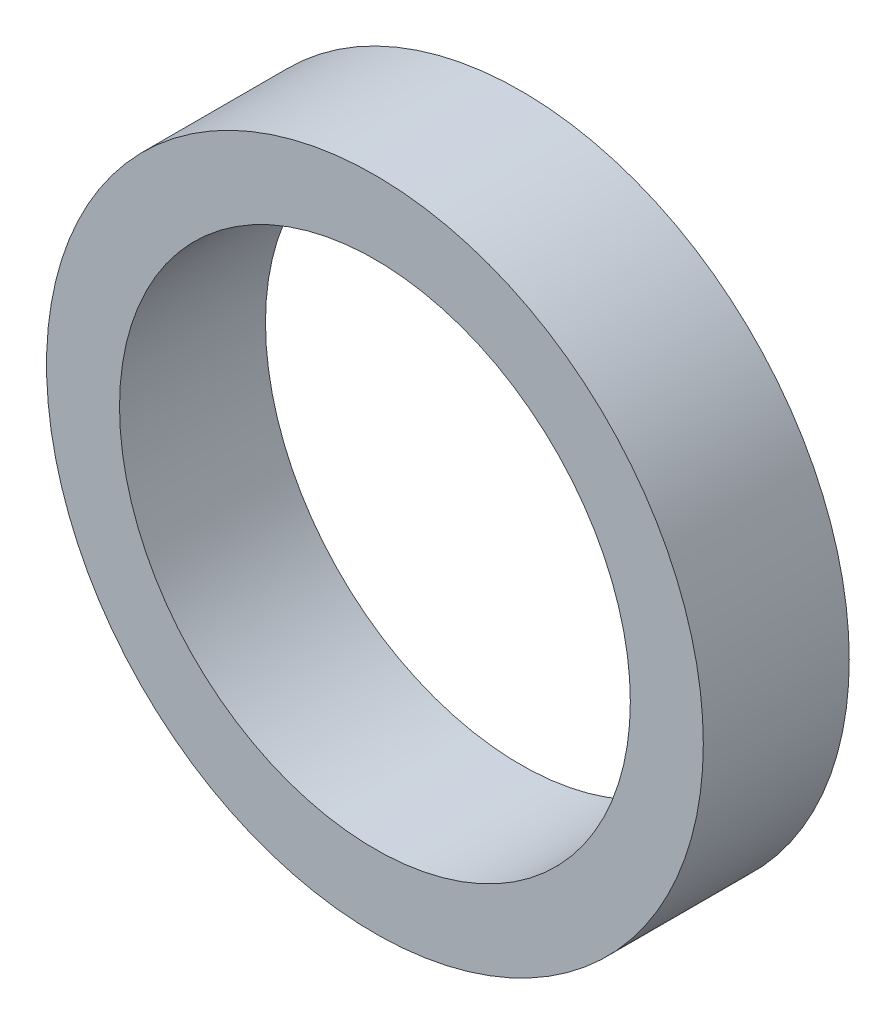
ISO-10303-21;
HEADER;
FILE_DESCRIPTION(('STEP AP214'),'2;1');
FILE_NAME('part.step','',(''),(''),'','','');
FILE_SCHEMA(('AUTOMOTIVE_DESIGN { 1 0 10303 214 1 1 1 1 }'));
ENDSEC;
DATA;
#1=APPLICATION_CONTEXT('core data for automotive mechanical design processes');
#2=APPLICATION_PROTOCOL_DEFINITION('international standard','automotive_design',2000,#1);
#3=PRODUCT_CONTEXT('',#1,'mechanical');
#4=PRODUCT('Part','Part','',(#3));
#5=PRODUCT_RELATED_PRODUCT_CATEGORY('part','',(#4));
#6=PRODUCT_DEFINITION_FORMATION('','',#4);
#7=PRODUCT_DEFINITION_CONTEXT('part definition',#1,'design');
#8=PRODUCT_DEFINITION('design','',#6,#7);
#9=PRODUCT_DEFINITION_SHAPE('','',#8);
#10=(LENGTH_UNIT() NAMED_UNIT(*) SI_UNIT(.MILLI.,.METRE.));
#11=(NAMED_UNIT(*) PLANE_ANGLE_UNIT() SI_UNIT($,.RADIAN.));
#12=(NAMED_UNIT(*) SI_UNIT($,.STERADIAN.) SOLID_ANGLE_UNIT());
#13=UNCERTAINTY_MEASURE_WITH_UNIT(LENGTH_MEASURE(1.E-05),#10,'distance_accuracy_value','');
#14=(GEOMETRIC_REPRESENTATION_CONTEXT(3) GLOBAL_UNCERTAINTY_ASSIGNED_CONTEXT((#13)) GLOBAL_UNIT_ASSIGNED_CONTEXT((#10,
#11,#12)) REPRESENTATION_CONTEXT('',''));
#15=CARTESIAN_POINT('',(0.,0.,0.));
#16=DIRECTION('',(0.,0.,1.));
#17=DIRECTION('',(1.,0.,0.));
#18=AXIS2_PLACEMENT_3D('',#15,#16,#17);
#19=CARTESIAN_POINT('',(0.,0.,4.));
#20=DIRECTION('',(0.,0.,1.));
#21=DIRECTION('',(1.,0.,0.));
#22=AXIS2_PLACEMENT_3D('',#19,#20,#21);
#23=PLANE('',#22);
#24=CARTESIAN_POINT('',(0.,0.,4.));
#25=DIRECTION('',(0.,0.,1.));
#26=DIRECTION('',(1.,0.,0.));
#27=AXIS2_PLACEMENT_3D('',#24,#25,#26);
#28=CIRCLE('',#27,9.);
#29=CARTESIAN_POINT('',(9.,0.,4.));
#30=VERTEX_POINT('',#29);
#31=EDGE_CURVE('E10',#30,#30,#28,.T.);
#32=ORIENTED_EDGE('',*,*,#31,.T.);
#33=EDGE_LOOP('',(#32));
#34=FACE_BOUND('',#33,.T.);
#35=CARTESIAN_POINT('',(0.,0.,4.));
#36=DIRECTION('',(0.,0.,1.));
#37=DIRECTION('',(1.,0.,0.));
#38=AXIS2_PLACEMENT_3D('',#35,#36,#37);
#39=CIRCLE('',#38,7.);
#40=CARTESIAN_POINT('',(7.,0.,4.));
#41=VERTEX_POINT('',#40);
#42=EDGE_CURVE('E42',#41,#41,#39,.T.);
#43=ORIENTED_EDGE('',*,*,#42,.F.);
#44=EDGE_LOOP('',(#43));
#45=FACE_BOUND('',#44,.T.);
#46=ADVANCED_FACE('F31',(#34,#45),#23,.T.);
#47=CARTESIAN_POINT('',(0.,0.,0.));
#48=DIRECTION('',(0.,0.,1.));
#49=DIRECTION('',(1.,0.,0.));
#50=AXIS2_PLACEMENT_3D('',#47,#48,#49);
#51=PLANE('',#50);
#52=CARTESIAN_POINT('',(0.,0.,0.));
#53=DIRECTION('',(0.,0.,1.));
#54=DIRECTION('',(1.,0.,0.));
#55=AXIS2_PLACEMENT_3D('',#52,#53,#54);
#56=CIRCLE('',#55,9.);
#57=CARTESIAN_POINT('',(9.,0.,0.));
#58=VERTEX_POINT('',#57);
#59=EDGE_CURVE('E35',#58,#58,#56,.T.);
#60=ORIENTED_EDGE('',*,*,#59,.F.);
#61=EDGE_LOOP('',(#60));
#62=FACE_BOUND('',#61,.T.);
#63=CARTESIAN_POINT('',(0.,0.,0.));
#64=DIRECTION('',(0.,0.,1.));
#65=DIRECTION('',(1.,0.,0.));
#66=AXIS2_PLACEMENT_3D('',#63,#64,#65);
#67=CIRCLE('',#66,7.);
#68=CARTESIAN_POINT('',(7.,0.,0.));
#69=VERTEX_POINT('',#68);
#70=EDGE_CURVE('E44',#69,#69,#67,.T.);
#71=ORIENTED_EDGE('',*,*,#70,.T.);
#72=EDGE_LOOP('',(#71));
#73=FACE_BOUND('',#72,.T.);
#74=ADVANCED_FACE('F54',(#62,#73),#51,.F.);
#75=CARTESIAN_POINT('',(0.,0.,4.));
#76=DIRECTION('',(0.,0.,-1.));
#77=DIRECTION('',(-1.,0.,0.));
#78=AXIS2_PLACEMENT_3D('',#75,#76,#77);
#79=CYLINDRICAL_SURFACE('',#78,9.);
#80=ORIENTED_EDGE('',*,*,#31,.F.);
#81=EDGE_LOOP('',(#80));
#82=FACE_BOUND('',#81,.T.);
#83=ORIENTED_EDGE('',*,*,#59,.T.);
#84=EDGE_LOOP('',(#83));
#85=FACE_BOUND('',#84,.T.);
#86=ADVANCED_FACE('F33',(#82,#85),#79,.T.);
#87=CARTESIAN_POINT('',(0.,0.,4.));
#88=DIRECTION('',(0.,0.,-1.));
#89=DIRECTION('',(-1.,0.,0.));
#90=AXIS2_PLACEMENT_3D('',#87,#88,#89);
#91=CYLINDRICAL_SURFACE('',#90,7.);
#92=ORIENTED_EDGE('',*,*,#42,.T.);
#93=EDGE_LOOP('',(#92));
#94=FACE_BOUND('',#93,.T.);
#95=ORIENTED_EDGE('',*,*,#70,.F.);
#96=EDGE_LOOP('',(#95));
#97=FACE_BOUND('',#96,.T.);
#98=ADVANCED_FACE('F50',(#94,#97),#91,.F.);
#99=CLOSED_SHELL('',(#46,#74,#86,#98));
#100=MANIFOLD_SOLID_BREP('B2',#99);
#101=ADVANCED_BREP_SHAPE_REPRESENTATION('',(#18,#100),#14);
#102=SHAPE_DEFINITION_REPRESENTATION(#9,#101);
ENDSEC;
END-ISO-10303-21;
